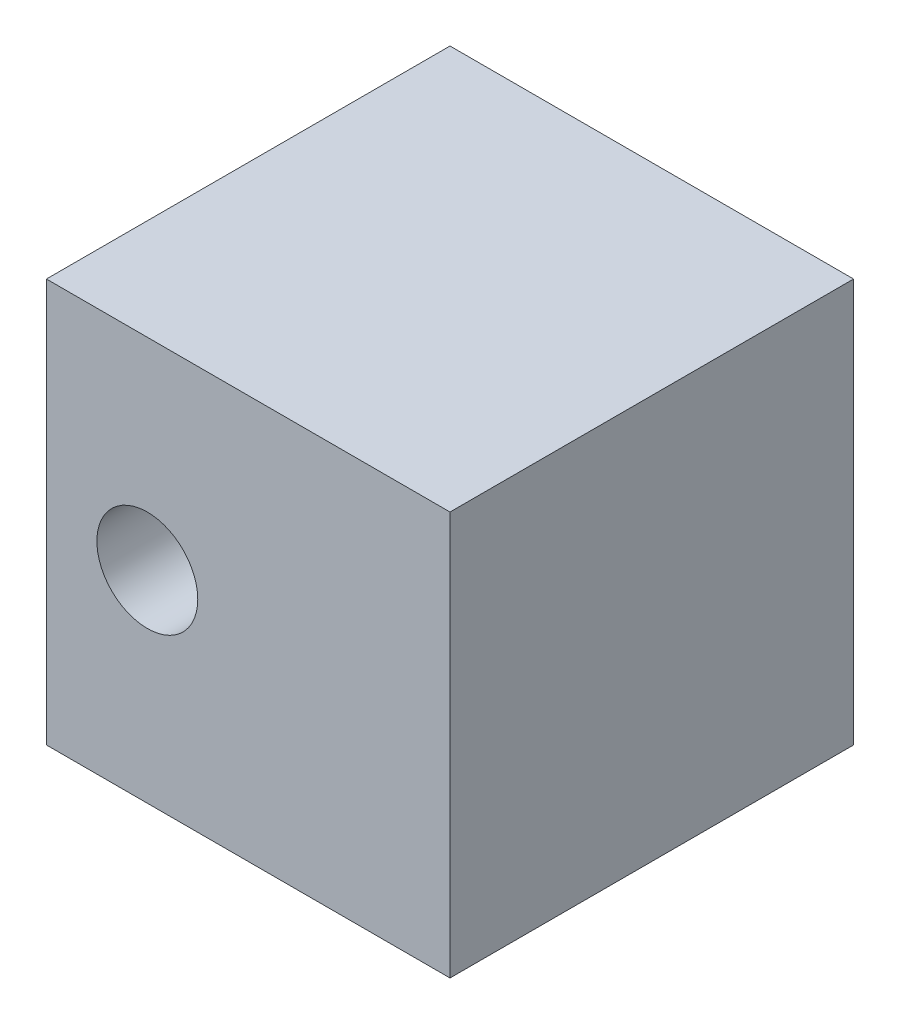
ISO-10303-21;
HEADER;
FILE_DESCRIPTION(('STEP AP214'),'2;1');
FILE_NAME('part.step','',(''),(''),'','','');
FILE_SCHEMA(('AUTOMOTIVE_DESIGN { 1 0 10303 214 1 1 1 1 }'));
ENDSEC;
DATA;
#1=APPLICATION_CONTEXT('core data for automotive mechanical design processes');
#2=APPLICATION_PROTOCOL_DEFINITION('international standard','automotive_design',2000,#1);
#3=PRODUCT_CONTEXT('',#1,'mechanical');
#4=PRODUCT('Part','Part','',(#3));
#5=PRODUCT_RELATED_PRODUCT_CATEGORY('part','',(#4));
#6=PRODUCT_DEFINITION_FORMATION('','',#4);
#7=PRODUCT_DEFINITION_CONTEXT('part definition',#1,'design');
#8=PRODUCT_DEFINITION('design','',#6,#7);
#9=PRODUCT_DEFINITION_SHAPE('','',#8);
#10=(LENGTH_UNIT() NAMED_UNIT(*) SI_UNIT(.MILLI.,.METRE.));
#11=(NAMED_UNIT(*) PLANE_ANGLE_UNIT() SI_UNIT($,.RADIAN.));
#12=(NAMED_UNIT(*) SI_UNIT($,.STERADIAN.) SOLID_ANGLE_UNIT());
#13=UNCERTAINTY_MEASURE_WITH_UNIT(LENGTH_MEASURE(1.E-05),#10,'distance_accuracy_value','');
#14=(GEOMETRIC_REPRESENTATION_CONTEXT(3) GLOBAL_UNCERTAINTY_ASSIGNED_CONTEXT((#13)) GLOBAL_UNIT_ASSIGNED_CONTEXT((#10,
#11,#12)) REPRESENTATION_CONTEXT('',''));
#15=CARTESIAN_POINT('',(0.,0.,0.));
#16=DIRECTION('',(0.,0.,1.));
#17=DIRECTION('',(1.,0.,0.));
#18=AXIS2_PLACEMENT_3D('',#15,#16,#17);
#19=CARTESIAN_POINT('',(0.,25.4,0.));
#20=DIRECTION('',(1.,0.,0.));
#21=DIRECTION('',(0.,0.,-1.));
#22=AXIS2_PLACEMENT_3D('',#19,#20,#21);
#23=PLANE('',#22);
#24=DIRECTION('',(0.,0.,1.));
#25=VECTOR('',#24,1.);
#26=CARTESIAN_POINT('',(0.,0.,0.));
#27=LINE('',#26,#25);
#28=CARTESIAN_POINT('',(0.,0.,-25.4));
#29=VERTEX_POINT('',#28);
#30=CARTESIAN_POINT('',(0.,0.,0.));
#31=VERTEX_POINT('',#30);
#32=EDGE_CURVE('E111',#29,#31,#27,.T.);
#33=ORIENTED_EDGE('',*,*,#32,.T.);
#34=DIRECTION('',(0.,-1.,0.));
#35=VECTOR('',#34,1.);
#36=CARTESIAN_POINT('',(0.,25.4,0.));
#37=LINE('',#36,#35);
#38=CARTESIAN_POINT('',(0.,25.4,0.));
#39=VERTEX_POINT('',#38);
#40=EDGE_CURVE('E11',#39,#31,#37,.T.);
#41=ORIENTED_EDGE('',*,*,#40,.F.);
#42=DIRECTION('',(0.,0.,1.));
#43=VECTOR('',#42,1.);
#44=CARTESIAN_POINT('',(0.,25.4,0.));
#45=LINE('',#44,#43);
#46=CARTESIAN_POINT('',(0.,25.4,-25.4));
#47=VERTEX_POINT('',#46);
#48=EDGE_CURVE('E95',#47,#39,#45,.T.);
#49=ORIENTED_EDGE('',*,*,#48,.F.);
#50=DIRECTION('',(0.,-1.,0.));
#51=VECTOR('',#50,1.);
#52=CARTESIAN_POINT('',(0.,25.4,-25.4));
#53=LINE('',#52,#51);
#54=EDGE_CURVE('E107',#47,#29,#53,.T.);
#55=ORIENTED_EDGE('',*,*,#54,.T.);
#56=EDGE_LOOP('',(#33,#41,#49,#55));
#57=FACE_BOUND('',#56,.T.);
#58=ADVANCED_FACE('F43',(#57),#23,.F.);
#59=CARTESIAN_POINT('',(0.,25.4,0.));
#60=DIRECTION('',(0.,0.,-1.));
#61=DIRECTION('',(-1.,0.,0.));
#62=AXIS2_PLACEMENT_3D('',#59,#60,#61);
#63=PLANE('',#62);
#64=CARTESIAN_POINT('',(6.35,12.7,0.));
#65=DIRECTION('',(0.,0.,1.));
#66=DIRECTION('',(1.,0.,0.));
#67=AXIS2_PLACEMENT_3D('',#64,#65,#66);
#68=CIRCLE('',#67,3.175);
#69=CARTESIAN_POINT('',(9.525,12.7,0.));
#70=VERTEX_POINT('',#69);
#71=EDGE_CURVE('E132',#70,#70,#68,.T.);
#72=ORIENTED_EDGE('',*,*,#71,.F.);
#73=EDGE_LOOP('',(#72));
#74=FACE_BOUND('',#73,.T.);
#75=DIRECTION('',(1.,0.,0.));
#76=VECTOR('',#75,1.);
#77=CARTESIAN_POINT('',(0.,0.,0.));
#78=LINE('',#77,#76);
#79=CARTESIAN_POINT('',(25.4,0.,0.));
#80=VERTEX_POINT('',#79);
#81=EDGE_CURVE('E100',#31,#80,#78,.T.);
#82=ORIENTED_EDGE('',*,*,#81,.T.);
#83=DIRECTION('',(0.,-1.,0.));
#84=VECTOR('',#83,1.);
#85=CARTESIAN_POINT('',(25.4,25.4,0.));
#86=LINE('',#85,#84);
#87=CARTESIAN_POINT('',(25.4,25.4,0.));
#88=VERTEX_POINT('',#87);
#89=EDGE_CURVE('E52',#88,#80,#86,.T.);
#90=ORIENTED_EDGE('',*,*,#89,.F.);
#91=DIRECTION('',(1.,0.,0.));
#92=VECTOR('',#91,1.);
#93=CARTESIAN_POINT('',(0.,25.4,0.));
#94=LINE('',#93,#92);
#95=EDGE_CURVE('E90',#39,#88,#94,.T.);
#96=ORIENTED_EDGE('',*,*,#95,.F.);
#97=ORIENTED_EDGE('',*,*,#40,.T.);
#98=EDGE_LOOP('',(#82,#90,#96,#97));
#99=FACE_BOUND('',#98,.T.);
#100=ADVANCED_FACE('F99',(#74,#99),#63,.F.);
#101=CARTESIAN_POINT('',(25.4,25.4,0.));
#102=DIRECTION('',(-1.,0.,0.));
#103=DIRECTION('',(0.,0.,1.));
#104=AXIS2_PLACEMENT_3D('',#101,#102,#103);
#105=PLANE('',#104);
#106=DIRECTION('',(0.,0.,-1.));
#107=VECTOR('',#106,1.);
#108=CARTESIAN_POINT('',(25.4,0.,0.));
#109=LINE('',#108,#107);
#110=CARTESIAN_POINT('',(25.4,0.,-25.4));
#111=VERTEX_POINT('',#110);
#112=EDGE_CURVE('E77',#80,#111,#109,.T.);
#113=ORIENTED_EDGE('',*,*,#112,.T.);
#114=DIRECTION('',(0.,-1.,0.));
#115=VECTOR('',#114,1.);
#116=CARTESIAN_POINT('',(25.4,25.4,-25.4));
#117=LINE('',#116,#115);
#118=CARTESIAN_POINT('',(25.4,25.4,-25.4));
#119=VERTEX_POINT('',#118);
#120=EDGE_CURVE('E102',#119,#111,#117,.T.);
#121=ORIENTED_EDGE('',*,*,#120,.F.);
#122=DIRECTION('',(0.,0.,-1.));
#123=VECTOR('',#122,1.);
#124=CARTESIAN_POINT('',(25.4,25.4,0.));
#125=LINE('',#124,#123);
#126=EDGE_CURVE('E93',#88,#119,#125,.T.);
#127=ORIENTED_EDGE('',*,*,#126,.F.);
#128=ORIENTED_EDGE('',*,*,#89,.T.);
#129=EDGE_LOOP('',(#113,#121,#127,#128));
#130=FACE_BOUND('',#129,.T.);
#131=ADVANCED_FACE('F103',(#130),#105,.F.);
#132=CARTESIAN_POINT('',(0.,25.4,-25.4));
#133=DIRECTION('',(0.,0.,1.));
#134=DIRECTION('',(1.,0.,0.));
#135=AXIS2_PLACEMENT_3D('',#132,#133,#134);
#136=PLANE('',#135);
#137=CARTESIAN_POINT('',(6.35,12.7,-25.4));
#138=DIRECTION('',(0.,0.,1.));
#139=DIRECTION('',(1.,0.,0.));
#140=AXIS2_PLACEMENT_3D('',#137,#138,#139);
#141=CIRCLE('',#140,3.175);
#142=CARTESIAN_POINT('',(9.525,12.7,-25.4));
#143=VERTEX_POINT('',#142);
#144=EDGE_CURVE('E115',#143,#143,#141,.T.);
#145=ORIENTED_EDGE('',*,*,#144,.T.);
#146=EDGE_LOOP('',(#145));
#147=FACE_BOUND('',#146,.T.);
#148=DIRECTION('',(-1.,0.,0.));
#149=VECTOR('',#148,1.);
#150=CARTESIAN_POINT('',(0.,0.,-25.4));
#151=LINE('',#150,#149);
#152=EDGE_CURVE('E83',#111,#29,#151,.T.);
#153=ORIENTED_EDGE('',*,*,#152,.T.);
#154=ORIENTED_EDGE('',*,*,#54,.F.);
#155=DIRECTION('',(-1.,0.,0.));
#156=VECTOR('',#155,1.);
#157=CARTESIAN_POINT('',(0.,25.4,-25.4));
#158=LINE('',#157,#156);
#159=EDGE_CURVE('E60',#119,#47,#158,.T.);
#160=ORIENTED_EDGE('',*,*,#159,.F.);
#161=ORIENTED_EDGE('',*,*,#120,.T.);
#162=EDGE_LOOP('',(#153,#154,#160,#161));
#163=FACE_BOUND('',#162,.T.);
#164=ADVANCED_FACE('F125',(#147,#163),#136,.F.);
#165=CARTESIAN_POINT('',(0.,25.4,0.));
#166=DIRECTION('',(0.,-1.,0.));
#167=DIRECTION('',(0.,0.,-1.));
#168=AXIS2_PLACEMENT_3D('',#165,#166,#167);
#169=PLANE('',#168);
#170=ORIENTED_EDGE('',*,*,#48,.T.);
#171=ORIENTED_EDGE('',*,*,#95,.T.);
#172=ORIENTED_EDGE('',*,*,#126,.T.);
#173=ORIENTED_EDGE('',*,*,#159,.T.);
#174=EDGE_LOOP('',(#170,#171,#172,#173));
#175=FACE_BOUND('',#174,.T.);
#176=ADVANCED_FACE('F91',(#175),#169,.F.);
#177=CARTESIAN_POINT('',(0.,0.,0.));
#178=DIRECTION('',(0.,-1.,0.));
#179=DIRECTION('',(0.,0.,-1.));
#180=AXIS2_PLACEMENT_3D('',#177,#178,#179);
#181=PLANE('',#180);
#182=ORIENTED_EDGE('',*,*,#32,.F.);
#183=ORIENTED_EDGE('',*,*,#152,.F.);
#184=ORIENTED_EDGE('',*,*,#112,.F.);
#185=ORIENTED_EDGE('',*,*,#81,.F.);
#186=EDGE_LOOP('',(#182,#183,#184,#185));
#187=FACE_BOUND('',#186,.T.);
#188=ADVANCED_FACE('F128',(#187),#181,.T.);
#189=CARTESIAN_POINT('',(6.35,12.7,-25.4));
#190=DIRECTION('',(0.,0.,1.));
#191=DIRECTION('',(1.,0.,0.));
#192=AXIS2_PLACEMENT_3D('',#189,#190,#191);
#193=CYLINDRICAL_SURFACE('',#192,3.175);
#194=ORIENTED_EDGE('',*,*,#144,.F.);
#195=EDGE_LOOP('',(#194));
#196=FACE_BOUND('',#195,.T.);
#197=ORIENTED_EDGE('',*,*,#71,.T.);
#198=EDGE_LOOP('',(#197));
#199=FACE_BOUND('',#198,.T.);
#200=ADVANCED_FACE('F141',(#196,#199),#193,.F.);
#201=CLOSED_SHELL('',(#58,#100,#131,#164,#176,#188,#200));
#202=MANIFOLD_SOLID_BREP('B2',#201);
#203=ADVANCED_BREP_SHAPE_REPRESENTATION('',(#18,#202),#14);
#204=SHAPE_DEFINITION_REPRESENTATION(#9,#203);
ENDSEC;
END-ISO-10303-21;
